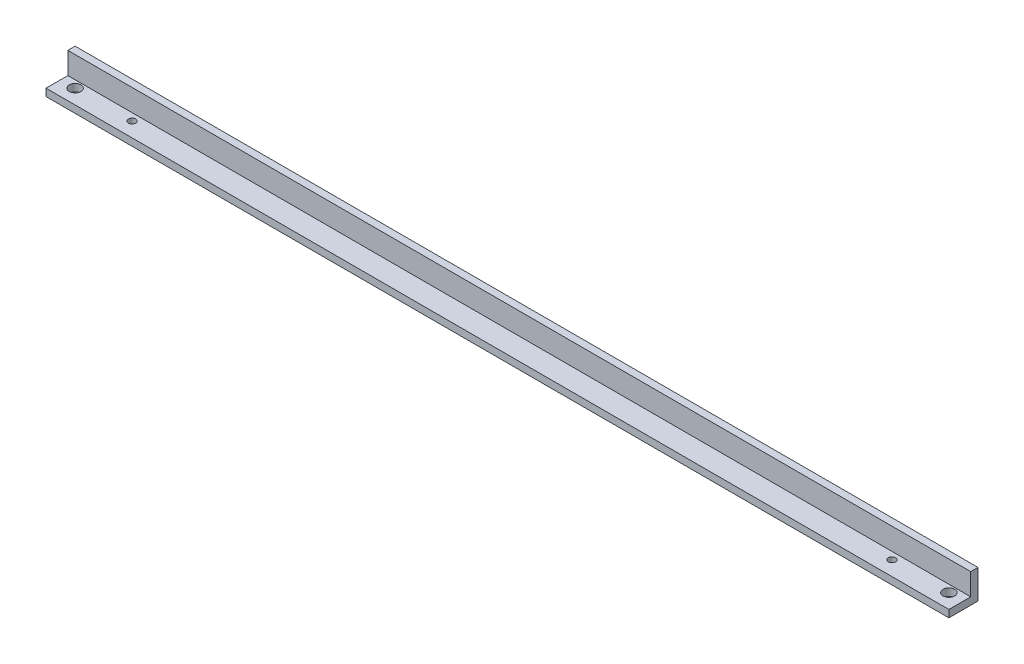
ISO-10303-21;
HEADER;
FILE_DESCRIPTION(('STEP AP214'),'2;1');
FILE_NAME('part.step','',(''),(''),'','','');
FILE_SCHEMA(('AUTOMOTIVE_DESIGN { 1 0 10303 214 1 1 1 1 }'));
ENDSEC;
DATA;
#1=APPLICATION_CONTEXT('core data for automotive mechanical design processes');
#2=APPLICATION_PROTOCOL_DEFINITION('international standard','automotive_design',2000,#1);
#3=PRODUCT_CONTEXT('',#1,'mechanical');
#4=PRODUCT('Part','Part','',(#3));
#5=PRODUCT_RELATED_PRODUCT_CATEGORY('part','',(#4));
#6=PRODUCT_DEFINITION_FORMATION('','',#4);
#7=PRODUCT_DEFINITION_CONTEXT('part definition',#1,'design');
#8=PRODUCT_DEFINITION('design','',#6,#7);
#9=PRODUCT_DEFINITION_SHAPE('','',#8);
#10=(LENGTH_UNIT() NAMED_UNIT(*) SI_UNIT(.MILLI.,.METRE.));
#11=(NAMED_UNIT(*) PLANE_ANGLE_UNIT() SI_UNIT($,.RADIAN.));
#12=(NAMED_UNIT(*) SI_UNIT($,.STERADIAN.) SOLID_ANGLE_UNIT());
#13=UNCERTAINTY_MEASURE_WITH_UNIT(LENGTH_MEASURE(1.E-05),#10,'distance_accuracy_value','');
#14=(GEOMETRIC_REPRESENTATION_CONTEXT(3) GLOBAL_UNCERTAINTY_ASSIGNED_CONTEXT((#13)) GLOBAL_UNIT_ASSIGNED_CONTEXT((#10,
#11,#12)) REPRESENTATION_CONTEXT('',''));
#15=CARTESIAN_POINT('',(0.,0.,0.));
#16=DIRECTION('',(0.,0.,1.));
#17=DIRECTION('',(1.,0.,0.));
#18=AXIS2_PLACEMENT_3D('',#15,#16,#17);
#19=CARTESIAN_POINT('',(787.4,19.05,0.));
#20=DIRECTION('',(0.,-1.,0.));
#21=DIRECTION('',(0.,0.,-1.));
#22=AXIS2_PLACEMENT_3D('',#19,#20,#21);
#23=PLANE('',#22);
#24=DIRECTION('',(0.,0.,1.));
#25=VECTOR('',#24,1.);
#26=CARTESIAN_POINT('',(0.,19.05,0.));
#27=LINE('',#26,#25);
#28=CARTESIAN_POINT('',(0.,19.05,-6.35));
#29=VERTEX_POINT('',#28);
#30=CARTESIAN_POINT('',(0.,19.05,0.));
#31=VERTEX_POINT('',#30);
#32=EDGE_CURVE('E127',#29,#31,#27,.T.);
#33=ORIENTED_EDGE('',*,*,#32,.T.);
#34=DIRECTION('',(-1.,0.,0.));
#35=VECTOR('',#34,1.);
#36=CARTESIAN_POINT('',(787.4,19.05,0.));
#37=LINE('',#36,#35);
#38=CARTESIAN_POINT('',(787.4,19.05,0.));
#39=VERTEX_POINT('',#38);
#40=EDGE_CURVE('E11',#39,#31,#37,.T.);
#41=ORIENTED_EDGE('',*,*,#40,.F.);
#42=DIRECTION('',(0.,0.,1.));
#43=VECTOR('',#42,1.);
#44=CARTESIAN_POINT('',(787.4,19.05,0.));
#45=LINE('',#44,#43);
#46=CARTESIAN_POINT('',(787.4,19.05,-6.35));
#47=VERTEX_POINT('',#46);
#48=EDGE_CURVE('E140',#47,#39,#45,.T.);
#49=ORIENTED_EDGE('',*,*,#48,.F.);
#50=DIRECTION('',(-1.,0.,0.));
#51=VECTOR('',#50,1.);
#52=CARTESIAN_POINT('',(787.4,19.05,-6.35));
#53=LINE('',#52,#51);
#54=EDGE_CURVE('E125',#47,#29,#53,.T.);
#55=ORIENTED_EDGE('',*,*,#54,.T.);
#56=EDGE_LOOP('',(#33,#41,#49,#55));
#57=FACE_BOUND('',#56,.T.);
#58=ADVANCED_FACE('F45',(#57),#23,.F.);
#59=CARTESIAN_POINT('',(787.4,0.,0.));
#60=DIRECTION('',(0.,0.,-1.));
#61=DIRECTION('',(-1.,0.,0.));
#62=AXIS2_PLACEMENT_3D('',#59,#60,#61);
#63=PLANE('',#62);
#64=DIRECTION('',(0.,-1.,0.));
#65=VECTOR('',#64,1.);
#66=CARTESIAN_POINT('',(0.,0.,0.));
#67=LINE('',#66,#65);
#68=CARTESIAN_POINT('',(0.,0.,0.));
#69=VERTEX_POINT('',#68);
#70=EDGE_CURVE('E126',#31,#69,#67,.T.);
#71=ORIENTED_EDGE('',*,*,#70,.T.);
#72=DIRECTION('',(-1.,0.,0.));
#73=VECTOR('',#72,1.);
#74=CARTESIAN_POINT('',(787.4,0.,0.));
#75=LINE('',#74,#73);
#76=CARTESIAN_POINT('',(787.4,0.,0.));
#77=VERTEX_POINT('',#76);
#78=EDGE_CURVE('E49',#77,#69,#75,.T.);
#79=ORIENTED_EDGE('',*,*,#78,.F.);
#80=DIRECTION('',(0.,-1.,0.));
#81=VECTOR('',#80,1.);
#82=CARTESIAN_POINT('',(787.4,0.,0.));
#83=LINE('',#82,#81);
#84=EDGE_CURVE('E91',#39,#77,#83,.T.);
#85=ORIENTED_EDGE('',*,*,#84,.F.);
#86=ORIENTED_EDGE('',*,*,#40,.T.);
#87=EDGE_LOOP('',(#71,#79,#85,#86));
#88=FACE_BOUND('',#87,.T.);
#89=ADVANCED_FACE('F161',(#88),#63,.F.);
#90=CARTESIAN_POINT('',(787.4,0.,19.05));
#91=DIRECTION('',(0.,-1.,0.));
#92=DIRECTION('',(0.,0.,-1.));
#93=AXIS2_PLACEMENT_3D('',#90,#91,#92);
#94=PLANE('',#93);
#95=CARTESIAN_POINT('',(12.7,0.,6.35));
#96=DIRECTION('',(0.,-1.,0.));
#97=DIRECTION('',(0.,0.,-1.));
#98=AXIS2_PLACEMENT_3D('',#95,#96,#97);
#99=CIRCLE('',#98,5.08);
#100=CARTESIAN_POINT('',(12.7,0.,1.27));
#101=VERTEX_POINT('',#100);
#102=EDGE_CURVE('E128',#101,#101,#99,.T.);
#103=ORIENTED_EDGE('',*,*,#102,.T.);
#104=EDGE_LOOP('',(#103));
#105=FACE_BOUND('',#104,.T.);
#106=CARTESIAN_POINT('',(62.357,0.,6.35));
#107=DIRECTION('',(0.,-1.,0.));
#108=DIRECTION('',(0.,0.,-1.));
#109=AXIS2_PLACEMENT_3D('',#106,#107,#108);
#110=CIRCLE('',#109,3.17500000000001);
#111=CARTESIAN_POINT('',(62.357,0.,3.17499999999999));
#112=VERTEX_POINT('',#111);
#113=EDGE_CURVE('E255',#112,#112,#110,.T.);
#114=ORIENTED_EDGE('',*,*,#113,.T.);
#115=EDGE_LOOP('',(#114));
#116=FACE_BOUND('',#115,.T.);
#117=CARTESIAN_POINT('',(725.043,0.,6.35000000000008));
#118=DIRECTION('',(0.,-1.,0.));
#119=DIRECTION('',(0.,0.,-1.));
#120=AXIS2_PLACEMENT_3D('',#117,#118,#119);
#121=CIRCLE('',#120,3.17500000000008);
#122=CARTESIAN_POINT('',(725.043,0.,3.175));
#123=VERTEX_POINT('',#122);
#124=EDGE_CURVE('E253',#123,#123,#121,.T.);
#125=ORIENTED_EDGE('',*,*,#124,.T.);
#126=EDGE_LOOP('',(#125));
#127=FACE_BOUND('',#126,.T.);
#128=CARTESIAN_POINT('',(774.7,0.,6.35000000000009));
#129=DIRECTION('',(0.,-1.,0.));
#130=DIRECTION('',(0.,0.,-1.));
#131=AXIS2_PLACEMENT_3D('',#128,#129,#130);
#132=CIRCLE('',#131,5.08000000000002);
#133=CARTESIAN_POINT('',(774.7,0.,1.27000000000008));
#134=VERTEX_POINT('',#133);
#135=EDGE_CURVE('E262',#134,#134,#132,.T.);
#136=ORIENTED_EDGE('',*,*,#135,.T.);
#137=EDGE_LOOP('',(#136));
#138=FACE_BOUND('',#137,.T.);
#139=DIRECTION('',(0.,0.,1.));
#140=VECTOR('',#139,1.);
#141=CARTESIAN_POINT('',(0.,0.,19.05));
#142=LINE('',#141,#140);
#143=CARTESIAN_POINT('',(0.,0.,19.05));
#144=VERTEX_POINT('',#143);
#145=EDGE_CURVE('E132',#69,#144,#142,.T.);
#146=ORIENTED_EDGE('',*,*,#145,.T.);
#147=DIRECTION('',(-1.,0.,0.));
#148=VECTOR('',#147,1.);
#149=CARTESIAN_POINT('',(787.4,0.,19.05));
#150=LINE('',#149,#148);
#151=CARTESIAN_POINT('',(787.4,0.,19.05));
#152=VERTEX_POINT('',#151);
#153=EDGE_CURVE('E120',#152,#144,#150,.T.);
#154=ORIENTED_EDGE('',*,*,#153,.F.);
#155=DIRECTION('',(0.,0.,1.));
#156=VECTOR('',#155,1.);
#157=CARTESIAN_POINT('',(787.4,0.,19.05));
#158=LINE('',#157,#156);
#159=EDGE_CURVE('E108',#77,#152,#158,.T.);
#160=ORIENTED_EDGE('',*,*,#159,.F.);
#161=ORIENTED_EDGE('',*,*,#78,.T.);
#162=EDGE_LOOP('',(#146,#154,#160,#161));
#163=FACE_BOUND('',#162,.T.);
#164=ADVANCED_FACE('F141',(#105,#116,#127,#138,#163),#94,.F.);
#165=CARTESIAN_POINT('',(787.4,-6.35,19.05));
#166=DIRECTION('',(0.,0.,-1.));
#167=DIRECTION('',(-1.,0.,0.));
#168=AXIS2_PLACEMENT_3D('',#165,#166,#167);
#169=PLANE('',#168);
#170=DIRECTION('',(0.,-1.,0.));
#171=VECTOR('',#170,1.);
#172=CARTESIAN_POINT('',(0.,-6.35,19.05));
#173=LINE('',#172,#171);
#174=CARTESIAN_POINT('',(0.,-6.35,19.05));
#175=VERTEX_POINT('',#174);
#176=EDGE_CURVE('E116',#144,#175,#173,.T.);
#177=ORIENTED_EDGE('',*,*,#176,.T.);
#178=DIRECTION('',(-1.,0.,0.));
#179=VECTOR('',#178,1.);
#180=CARTESIAN_POINT('',(787.4,-6.35,19.05));
#181=LINE('',#180,#179);
#182=CARTESIAN_POINT('',(787.4,-6.35,19.05));
#183=VERTEX_POINT('',#182);
#184=EDGE_CURVE('E113',#183,#175,#181,.T.);
#185=ORIENTED_EDGE('',*,*,#184,.F.);
#186=DIRECTION('',(0.,-1.,0.));
#187=VECTOR('',#186,1.);
#188=CARTESIAN_POINT('',(787.4,-6.35,19.05));
#189=LINE('',#188,#187);
#190=EDGE_CURVE('E105',#152,#183,#189,.T.);
#191=ORIENTED_EDGE('',*,*,#190,.F.);
#192=ORIENTED_EDGE('',*,*,#153,.T.);
#193=EDGE_LOOP('',(#177,#185,#191,#192));
#194=FACE_BOUND('',#193,.T.);
#195=ADVANCED_FACE('F112',(#194),#169,.F.);
#196=CARTESIAN_POINT('',(787.4,-6.35,-6.35));
#197=DIRECTION('',(0.,1.,0.));
#198=DIRECTION('',(0.,0.,1.));
#199=AXIS2_PLACEMENT_3D('',#196,#197,#198);
#200=PLANE('',#199);
#201=CARTESIAN_POINT('',(12.7,-6.35,6.35));
#202=DIRECTION('',(0.,-1.,0.));
#203=DIRECTION('',(0.,0.,-1.));
#204=AXIS2_PLACEMENT_3D('',#201,#202,#203);
#205=CIRCLE('',#204,5.08);
#206=CARTESIAN_POINT('',(12.7,-6.35000000000008,1.27));
#207=VERTEX_POINT('',#206);
#208=EDGE_CURVE('E248',#207,#207,#205,.T.);
#209=ORIENTED_EDGE('',*,*,#208,.F.);
#210=EDGE_LOOP('',(#209));
#211=FACE_BOUND('',#210,.T.);
#212=CARTESIAN_POINT('',(62.357,-6.35,6.35));
#213=DIRECTION('',(0.,-1.,0.));
#214=DIRECTION('',(0.,0.,-1.));
#215=AXIS2_PLACEMENT_3D('',#212,#213,#214);
#216=CIRCLE('',#215,3.17500000000001);
#217=CARTESIAN_POINT('',(62.357,-6.35000000000008,3.17499999999999));
#218=VERTEX_POINT('',#217);
#219=EDGE_CURVE('E272',#218,#218,#216,.T.);
#220=ORIENTED_EDGE('',*,*,#219,.F.);
#221=EDGE_LOOP('',(#220));
#222=FACE_BOUND('',#221,.T.);
#223=CARTESIAN_POINT('',(725.043,-6.35,6.35000000000008));
#224=DIRECTION('',(0.,-1.,0.));
#225=DIRECTION('',(0.,0.,1.));
#226=AXIS2_PLACEMENT_3D('',#223,#224,#225);
#227=CIRCLE('',#226,3.17500000000008);
#228=CARTESIAN_POINT('',(725.043,-6.35000000000008,3.175));
#229=VERTEX_POINT('',#228);
#230=EDGE_CURVE('E268',#229,#229,#227,.T.);
#231=ORIENTED_EDGE('',*,*,#230,.F.);
#232=EDGE_LOOP('',(#231));
#233=FACE_BOUND('',#232,.T.);
#234=CARTESIAN_POINT('',(774.7,-6.35,6.35000000000009));
#235=DIRECTION('',(0.,-1.,0.));
#236=DIRECTION('',(0.,0.,1.));
#237=AXIS2_PLACEMENT_3D('',#234,#235,#236);
#238=CIRCLE('',#237,5.08000000000002);
#239=CARTESIAN_POINT('',(774.7,-6.35000000000008,1.27000000000007));
#240=VERTEX_POINT('',#239);
#241=EDGE_CURVE('E265',#240,#240,#238,.T.);
#242=ORIENTED_EDGE('',*,*,#241,.F.);
#243=EDGE_LOOP('',(#242));
#244=FACE_BOUND('',#243,.T.);
#245=DIRECTION('',(0.,0.,-1.));
#246=VECTOR('',#245,1.);
#247=CARTESIAN_POINT('',(0.,-6.35,-6.35));
#248=LINE('',#247,#246);
#249=CARTESIAN_POINT('',(0.,-6.35,-6.35));
#250=VERTEX_POINT('',#249);
#251=EDGE_CURVE('E82',#175,#250,#248,.T.);
#252=ORIENTED_EDGE('',*,*,#251,.T.);
#253=DIRECTION('',(-1.,0.,0.));
#254=VECTOR('',#253,1.);
#255=CARTESIAN_POINT('',(787.4,-6.35,-6.35));
#256=LINE('',#255,#254);
#257=CARTESIAN_POINT('',(787.4,-6.35,-6.35));
#258=VERTEX_POINT('',#257);
#259=EDGE_CURVE('E117',#258,#250,#256,.T.);
#260=ORIENTED_EDGE('',*,*,#259,.F.);
#261=DIRECTION('',(0.,0.,-1.));
#262=VECTOR('',#261,1.);
#263=CARTESIAN_POINT('',(787.4,-6.35,-6.35));
#264=LINE('',#263,#262);
#265=EDGE_CURVE('E106',#183,#258,#264,.T.);
#266=ORIENTED_EDGE('',*,*,#265,.F.);
#267=ORIENTED_EDGE('',*,*,#184,.T.);
#268=EDGE_LOOP('',(#252,#260,#266,#267));
#269=FACE_BOUND('',#268,.T.);
#270=ADVANCED_FACE('F119',(#211,#222,#233,#244,#269),#200,.F.);
#271=CARTESIAN_POINT('',(787.4,19.05,-6.35));
#272=DIRECTION('',(0.,0.,1.));
#273=DIRECTION('',(0.,-1.,0.));
#274=AXIS2_PLACEMENT_3D('',#271,#272,#273);
#275=PLANE('',#274);
#276=DIRECTION('',(0.,1.,0.));
#277=VECTOR('',#276,1.);
#278=CARTESIAN_POINT('',(0.,19.05,-6.35));
#279=LINE('',#278,#277);
#280=EDGE_CURVE('E89',#250,#29,#279,.T.);
#281=ORIENTED_EDGE('',*,*,#280,.T.);
#282=ORIENTED_EDGE('',*,*,#54,.F.);
#283=DIRECTION('',(0.,1.,0.));
#284=VECTOR('',#283,1.);
#285=CARTESIAN_POINT('',(787.4,19.05,-6.35));
#286=LINE('',#285,#284);
#287=EDGE_CURVE('E59',#258,#47,#286,.T.);
#288=ORIENTED_EDGE('',*,*,#287,.F.);
#289=ORIENTED_EDGE('',*,*,#259,.T.);
#290=EDGE_LOOP('',(#281,#282,#288,#289));
#291=FACE_BOUND('',#290,.T.);
#292=ADVANCED_FACE('F148',(#291),#275,.F.);
#293=CARTESIAN_POINT('',(787.4,0.,0.));
#294=DIRECTION('',(-1.,0.,0.));
#295=DIRECTION('',(0.,0.,1.));
#296=AXIS2_PLACEMENT_3D('',#293,#294,#295);
#297=PLANE('',#296);
#298=ORIENTED_EDGE('',*,*,#48,.T.);
#299=ORIENTED_EDGE('',*,*,#84,.T.);
#300=ORIENTED_EDGE('',*,*,#159,.T.);
#301=ORIENTED_EDGE('',*,*,#190,.T.);
#302=ORIENTED_EDGE('',*,*,#265,.T.);
#303=ORIENTED_EDGE('',*,*,#287,.T.);
#304=EDGE_LOOP('',(#298,#299,#300,#301,#302,#303));
#305=FACE_BOUND('',#304,.T.);
#306=ADVANCED_FACE('F104',(#305),#297,.F.);
#307=CARTESIAN_POINT('',(0.,0.,0.));
#308=DIRECTION('',(-1.,0.,0.));
#309=DIRECTION('',(0.,0.,1.));
#310=AXIS2_PLACEMENT_3D('',#307,#308,#309);
#311=PLANE('',#310);
#312=ORIENTED_EDGE('',*,*,#32,.F.);
#313=ORIENTED_EDGE('',*,*,#280,.F.);
#314=ORIENTED_EDGE('',*,*,#251,.F.);
#315=ORIENTED_EDGE('',*,*,#176,.F.);
#316=ORIENTED_EDGE('',*,*,#145,.F.);
#317=ORIENTED_EDGE('',*,*,#70,.F.);
#318=EDGE_LOOP('',(#312,#313,#314,#315,#316,#317));
#319=FACE_BOUND('',#318,.T.);
#320=ADVANCED_FACE('F147',(#319),#311,.T.);
#321=CARTESIAN_POINT('',(774.7,908.05,6.35000000000022));
#322=DIRECTION('',(0.,-1.,0.));
#323=DIRECTION('',(0.,0.,-1.));
#324=AXIS2_PLACEMENT_3D('',#321,#322,#323);
#325=CYLINDRICAL_SURFACE('',#324,5.08000000000002);
#326=CARTESIAN_POINT('',(774.7,-6.35000000000008,1.27000000000007));
#327=CARTESIAN_POINT('',(774.7,-6.28385416666673,1.27000000000007));
#328=CARTESIAN_POINT('',(774.7,-6.21770833333339,1.27000000000007));
#329=CARTESIAN_POINT('',(774.7,-6.08541666666673,1.27000000000007));
#330=CARTESIAN_POINT('',(774.7,-6.01927083333342,1.27000000000007));
#331=CARTESIAN_POINT('',(774.7,-5.88697916666677,1.27000000000007));
#332=CARTESIAN_POINT('',(774.7,-5.82083333333342,1.27000000000007));
#333=CARTESIAN_POINT('',(774.7,-5.68854166666673,1.27000000000007));
#334=CARTESIAN_POINT('',(774.7,-5.62239583333339,1.27000000000007));
#335=CARTESIAN_POINT('',(774.7,-5.49010416666673,1.27000000000007));
#336=CARTESIAN_POINT('',(774.7,-5.42395833333342,1.27000000000008));
#337=CARTESIAN_POINT('',(774.7,-5.29166666666677,1.27000000000008));
#338=CARTESIAN_POINT('',(774.7,-5.22552083333342,1.27000000000008));
#339=CARTESIAN_POINT('',(774.7,-5.09322916666673,1.27000000000008));
#340=CARTESIAN_POINT('',(774.7,-5.02708333333339,1.27000000000008));
#341=CARTESIAN_POINT('',(774.7,-4.89479166666669,1.27000000000008));
#342=CARTESIAN_POINT('',(774.7,-4.82864583333335,1.27000000000008));
#343=CARTESIAN_POINT('',(774.7,-4.69635416666669,1.27000000000008));
#344=CARTESIAN_POINT('',(774.7,-4.63020833333339,1.27000000000008));
#345=CARTESIAN_POINT('',(774.7,-4.49791666666673,1.27000000000008));
#346=CARTESIAN_POINT('',(774.7,-4.43177083333339,1.27000000000008));
#347=CARTESIAN_POINT('',(774.7,-4.29947916666669,1.27000000000008));
#348=CARTESIAN_POINT('',(774.7,-4.23333333333335,1.27000000000008));
#349=CARTESIAN_POINT('',(774.7,-4.10104166666669,1.27000000000008));
#350=CARTESIAN_POINT('',(774.7,-4.03489583333339,1.27000000000008));
#351=CARTESIAN_POINT('',(774.7,-3.90260416666673,1.27000000000008));
#352=CARTESIAN_POINT('',(774.7,-3.83645833333338,1.27000000000008));
#353=CARTESIAN_POINT('',(774.7,-3.70416666666669,1.27000000000008));
#354=CARTESIAN_POINT('',(774.7,-3.63802083333335,1.27000000000008));
#355=CARTESIAN_POINT('',(774.7,-3.50572916666669,1.27000000000008));
#356=CARTESIAN_POINT('',(774.7,-3.43958333333338,1.27000000000008));
#357=CARTESIAN_POINT('',(774.7,-3.30729166666673,1.27000000000008));
#358=CARTESIAN_POINT('',(774.7,-3.24114583333338,1.27000000000008));
#359=CARTESIAN_POINT('',(774.7,-3.10885416666669,1.27000000000008));
#360=CARTESIAN_POINT('',(774.7,-3.04270833333335,1.27000000000008));
#361=CARTESIAN_POINT('',(774.7,-2.91041666666669,1.27000000000008));
#362=CARTESIAN_POINT('',(774.7,-2.84427083333338,1.27000000000008));
#363=CARTESIAN_POINT('',(774.7,-2.71197916666673,1.27000000000008));
#364=CARTESIAN_POINT('',(774.7,-2.64583333333338,1.27000000000008));
#365=CARTESIAN_POINT('',(774.7,-2.51354166666669,1.27000000000008));
#366=CARTESIAN_POINT('',(774.7,-2.44739583333335,1.27000000000008));
#367=CARTESIAN_POINT('',(774.7,-2.31510416666669,1.27000000000008));
#368=CARTESIAN_POINT('',(774.7,-2.24895833333338,1.27000000000008));
#369=CARTESIAN_POINT('',(774.7,-2.11666666666673,1.27000000000008));
#370=CARTESIAN_POINT('',(774.7,-2.05052083333338,1.27000000000008));
#371=CARTESIAN_POINT('',(774.7,-1.91822916666669,1.27000000000008));
#372=CARTESIAN_POINT('',(774.7,-1.85208333333335,1.27000000000008));
#373=CARTESIAN_POINT('',(774.7,-1.71979166666669,1.27000000000008));
#374=CARTESIAN_POINT('',(774.7,-1.65364583333338,1.27000000000008));
#375=CARTESIAN_POINT('',(774.7,-1.52135416666673,1.27000000000008));
#376=CARTESIAN_POINT('',(774.7,-1.45520833333338,1.27000000000008));
#377=CARTESIAN_POINT('',(774.7,-1.32291666666669,1.27000000000008));
#378=CARTESIAN_POINT('',(774.7,-1.25677083333335,1.27000000000008));
#379=CARTESIAN_POINT('',(774.7,-1.12447916666665,1.27000000000008));
#380=CARTESIAN_POINT('',(774.7,-1.05833333333331,1.27000000000008));
#381=CARTESIAN_POINT('',(774.7,-0.926041666666655,1.27000000000008));
#382=CARTESIAN_POINT('',(774.7,-0.859895833333346,1.27000000000008));
#383=CARTESIAN_POINT('',(774.7,-0.727604166666692,1.27000000000008));
#384=CARTESIAN_POINT('',(774.7,-0.661458333333346,1.27000000000008));
#385=CARTESIAN_POINT('',(774.7,-0.529166666666655,1.27000000000008));
#386=CARTESIAN_POINT('',(774.7,-0.463020833333309,1.27000000000008));
#387=CARTESIAN_POINT('',(774.7,-0.330729166666655,1.27000000000008));
#388=CARTESIAN_POINT('',(774.7,-0.264583333333346,1.27000000000008));
#389=CARTESIAN_POINT('',(774.7,-0.132291666666691,1.27000000000008));
#390=CARTESIAN_POINT('',(774.7,-0.0661458333333458,1.27000000000008));
#391=CARTESIAN_POINT('',(774.7,0.,1.27000000000008));
#392=B_SPLINE_CURVE_WITH_KNOTS('',3,(#326,#327,#328,#329,#330,#331,#332,#333,#334,#335,#336,
#337,#338,#339,#340,#341,#342,#343,#344,#345,#346,#347,#348,#349,#350,#351,#352,#353,#354,#355,
#356,#357,#358,#359,#360,#361,#362,#363,#364,#365,#366,#367,#368,#369,#370,#371,#372,#373,#374,
#375,#376,#377,#378,#379,#380,#381,#382,#383,#384,#385,#386,#387,#388,#389,#390,#391),
.UNSPECIFIED.,.F.,.F.,(4,2,2,2,2,2,2,2,2,2,2,2,2,2,2,2,2,2,2,2,2,2,2,2,2,2,2,2,2,2,2,2,4),(0.,
0.198437500000037,0.396874999999963,0.5953125,0.793750000000037,0.992187499999964,1.190625,
1.38906250000004,1.58750000000007,1.7859375,1.98437500000004,2.18281250000008,2.38125,
2.57968750000004,2.77812500000008,2.9765625,3.17500000000004,3.37343750000008,3.571875,
3.77031250000004,3.96875000000008,4.1671875,4.36562500000004,4.56406250000008,4.7625,
4.96093750000004,5.15937500000008,5.35781250000011,5.55625000000004,5.75468750000008,
5.95312500000011,6.15156250000004,6.35000000000008),.UNSPECIFIED.);
#393=EDGE_CURVE('BSEAM207',#240,#134,#392,.T.);
#394=ORIENTED_EDGE('',*,*,#241,.T.);
#395=ORIENTED_EDGE('',*,*,#135,.F.);
#396=ORIENTED_EDGE('',*,*,#393,.T.);
#397=ORIENTED_EDGE('',*,*,#393,.F.);
#398=EDGE_LOOP('',(#394,#396,#395,#397));
#399=FACE_BOUND('',#398,.T.);
#400=ADVANCED_FACE('F207',(#399),#325,.F.);
#401=CARTESIAN_POINT('',(725.043,908.05,6.3500000000002));
#402=DIRECTION('',(0.,-1.,0.));
#403=DIRECTION('',(0.,0.,-1.));
#404=AXIS2_PLACEMENT_3D('',#401,#402,#403);
#405=CYLINDRICAL_SURFACE('',#404,3.17500000000008);
#406=CARTESIAN_POINT('',(725.043,-6.35000000000008,3.175));
#407=CARTESIAN_POINT('',(725.043,-6.28385416666673,3.175));
#408=CARTESIAN_POINT('',(725.043,-6.21770833333339,3.175));
#409=CARTESIAN_POINT('',(725.043,-6.08541666666673,3.175));
#410=CARTESIAN_POINT('',(725.043,-6.01927083333342,3.175));
#411=CARTESIAN_POINT('',(725.043,-5.88697916666677,3.175));
#412=CARTESIAN_POINT('',(725.043,-5.82083333333342,3.175));
#413=CARTESIAN_POINT('',(725.043,-5.68854166666673,3.175));
#414=CARTESIAN_POINT('',(725.043,-5.62239583333339,3.175));
#415=CARTESIAN_POINT('',(725.043,-5.49010416666673,3.175));
#416=CARTESIAN_POINT('',(725.043,-5.42395833333342,3.175));
#417=CARTESIAN_POINT('',(725.043,-5.29166666666677,3.175));
#418=CARTESIAN_POINT('',(725.043,-5.22552083333342,3.175));
#419=CARTESIAN_POINT('',(725.043,-5.09322916666673,3.175));
#420=CARTESIAN_POINT('',(725.043,-5.02708333333339,3.175));
#421=CARTESIAN_POINT('',(725.043,-4.89479166666669,3.175));
#422=CARTESIAN_POINT('',(725.043,-4.82864583333335,3.175));
#423=CARTESIAN_POINT('',(725.043,-4.69635416666669,3.175));
#424=CARTESIAN_POINT('',(725.043,-4.63020833333339,3.175));
#425=CARTESIAN_POINT('',(725.043,-4.49791666666673,3.175));
#426=CARTESIAN_POINT('',(725.043,-4.43177083333339,3.175));
#427=CARTESIAN_POINT('',(725.043,-4.29947916666669,3.175));
#428=CARTESIAN_POINT('',(725.043,-4.23333333333335,3.175));
#429=CARTESIAN_POINT('',(725.043,-4.10104166666669,3.175));
#430=CARTESIAN_POINT('',(725.043,-4.03489583333339,3.175));
#431=CARTESIAN_POINT('',(725.043,-3.90260416666673,3.175));
#432=CARTESIAN_POINT('',(725.043,-3.83645833333338,3.175));
#433=CARTESIAN_POINT('',(725.043,-3.70416666666669,3.175));
#434=CARTESIAN_POINT('',(725.043,-3.63802083333335,3.175));
#435=CARTESIAN_POINT('',(725.043,-3.50572916666669,3.175));
#436=CARTESIAN_POINT('',(725.043,-3.43958333333338,3.175));
#437=CARTESIAN_POINT('',(725.043,-3.30729166666673,3.175));
#438=CARTESIAN_POINT('',(725.043,-3.24114583333338,3.175));
#439=CARTESIAN_POINT('',(725.043,-3.10885416666669,3.175));
#440=CARTESIAN_POINT('',(725.043,-3.04270833333335,3.175));
#441=CARTESIAN_POINT('',(725.043,-2.91041666666669,3.175));
#442=CARTESIAN_POINT('',(725.043,-2.84427083333338,3.175));
#443=CARTESIAN_POINT('',(725.043,-2.71197916666673,3.175));
#444=CARTESIAN_POINT('',(725.043,-2.64583333333338,3.175));
#445=CARTESIAN_POINT('',(725.043,-2.51354166666669,3.175));
#446=CARTESIAN_POINT('',(725.043,-2.44739583333335,3.175));
#447=CARTESIAN_POINT('',(725.043,-2.31510416666669,3.175));
#448=CARTESIAN_POINT('',(725.043,-2.24895833333338,3.175));
#449=CARTESIAN_POINT('',(725.043,-2.11666666666673,3.175));
#450=CARTESIAN_POINT('',(725.043,-2.05052083333338,3.175));
#451=CARTESIAN_POINT('',(725.043,-1.91822916666669,3.175));
#452=CARTESIAN_POINT('',(725.043,-1.85208333333335,3.175));
#453=CARTESIAN_POINT('',(725.043,-1.71979166666669,3.175));
#454=CARTESIAN_POINT('',(725.043,-1.65364583333338,3.175));
#455=CARTESIAN_POINT('',(725.043,-1.52135416666673,3.175));
#456=CARTESIAN_POINT('',(725.043,-1.45520833333338,3.175));
#457=CARTESIAN_POINT('',(725.043,-1.32291666666669,3.175));
#458=CARTESIAN_POINT('',(725.043,-1.25677083333335,3.175));
#459=CARTESIAN_POINT('',(725.043,-1.12447916666665,3.175));
#460=CARTESIAN_POINT('',(725.043,-1.05833333333331,3.175));
#461=CARTESIAN_POINT('',(725.043,-0.926041666666655,3.175));
#462=CARTESIAN_POINT('',(725.043,-0.859895833333346,3.175));
#463=CARTESIAN_POINT('',(725.043,-0.727604166666692,3.175));
#464=CARTESIAN_POINT('',(725.043,-0.661458333333346,3.175));
#465=CARTESIAN_POINT('',(725.043,-0.529166666666655,3.175));
#466=CARTESIAN_POINT('',(725.043,-0.463020833333309,3.175));
#467=CARTESIAN_POINT('',(725.043,-0.330729166666655,3.175));
#468=CARTESIAN_POINT('',(725.043,-0.264583333333346,3.175));
#469=CARTESIAN_POINT('',(725.043,-0.132291666666691,3.175));
#470=CARTESIAN_POINT('',(725.043,-0.0661458333333458,3.175));
#471=CARTESIAN_POINT('',(725.043,0.,3.175));
#472=B_SPLINE_CURVE_WITH_KNOTS('',3,(#406,#407,#408,#409,#410,#411,#412,#413,#414,#415,#416,
#417,#418,#419,#420,#421,#422,#423,#424,#425,#426,#427,#428,#429,#430,#431,#432,#433,#434,#435,
#436,#437,#438,#439,#440,#441,#442,#443,#444,#445,#446,#447,#448,#449,#450,#451,#452,#453,#454,
#455,#456,#457,#458,#459,#460,#461,#462,#463,#464,#465,#466,#467,#468,#469,#470,#471),
.UNSPECIFIED.,.F.,.F.,(4,2,2,2,2,2,2,2,2,2,2,2,2,2,2,2,2,2,2,2,2,2,2,2,2,2,2,2,2,2,2,2,4),(0.,
0.198437500000037,0.396874999999963,0.5953125,0.793750000000037,0.992187499999964,1.190625,
1.38906250000004,1.58750000000007,1.7859375,1.98437500000004,2.18281250000008,2.38125,
2.57968750000004,2.77812500000008,2.9765625,3.17500000000004,3.37343750000008,3.571875,
3.77031250000004,3.96875000000008,4.1671875,4.36562500000004,4.56406250000008,4.7625,
4.96093750000004,5.15937500000008,5.35781250000011,5.55625000000004,5.75468750000008,
5.95312500000011,6.15156250000004,6.35000000000008),.UNSPECIFIED.);
#473=EDGE_CURVE('BSEAM214',#229,#123,#472,.T.);
#474=ORIENTED_EDGE('',*,*,#230,.T.);
#475=ORIENTED_EDGE('',*,*,#124,.F.);
#476=ORIENTED_EDGE('',*,*,#473,.T.);
#477=ORIENTED_EDGE('',*,*,#473,.F.);
#478=EDGE_LOOP('',(#474,#476,#475,#477));
#479=FACE_BOUND('',#478,.T.);
#480=ADVANCED_FACE('F214',(#479),#405,.F.);
#481=CARTESIAN_POINT('',(62.357,908.05,6.35000000000012));
#482=DIRECTION('',(0.,-1.,0.));
#483=DIRECTION('',(0.,0.,-1.));
#484=AXIS2_PLACEMENT_3D('',#481,#482,#483);
#485=CYLINDRICAL_SURFACE('',#484,3.17500000000001);
#486=CARTESIAN_POINT('',(62.357,-6.35000000000008,3.17499999999999));
#487=CARTESIAN_POINT('',(62.357,-6.28385416666673,3.17499999999999));
#488=CARTESIAN_POINT('',(62.357,-6.21770833333339,3.17499999999999));
#489=CARTESIAN_POINT('',(62.357,-6.08541666666673,3.17499999999999));
#490=CARTESIAN_POINT('',(62.357,-6.01927083333342,3.17499999999999));
#491=CARTESIAN_POINT('',(62.357,-5.88697916666677,3.17499999999999));
#492=CARTESIAN_POINT('',(62.357,-5.82083333333342,3.17499999999999));
#493=CARTESIAN_POINT('',(62.357,-5.68854166666673,3.17499999999999));
#494=CARTESIAN_POINT('',(62.357,-5.62239583333339,3.17499999999999));
#495=CARTESIAN_POINT('',(62.357,-5.49010416666673,3.17499999999999));
#496=CARTESIAN_POINT('',(62.357,-5.42395833333342,3.17499999999999));
#497=CARTESIAN_POINT('',(62.357,-5.29166666666677,3.17499999999999));
#498=CARTESIAN_POINT('',(62.357,-5.22552083333342,3.17499999999999));
#499=CARTESIAN_POINT('',(62.357,-5.09322916666673,3.17499999999999));
#500=CARTESIAN_POINT('',(62.357,-5.02708333333339,3.17499999999999));
#501=CARTESIAN_POINT('',(62.357,-4.89479166666669,3.17499999999999));
#502=CARTESIAN_POINT('',(62.357,-4.82864583333335,3.17499999999999));
#503=CARTESIAN_POINT('',(62.357,-4.69635416666669,3.17499999999999));
#504=CARTESIAN_POINT('',(62.357,-4.63020833333339,3.17499999999999));
#505=CARTESIAN_POINT('',(62.357,-4.49791666666673,3.17499999999999));
#506=CARTESIAN_POINT('',(62.357,-4.43177083333339,3.17499999999999));
#507=CARTESIAN_POINT('',(62.357,-4.29947916666669,3.17499999999999));
#508=CARTESIAN_POINT('',(62.357,-4.23333333333335,3.17499999999999));
#509=CARTESIAN_POINT('',(62.357,-4.10104166666669,3.17499999999999));
#510=CARTESIAN_POINT('',(62.357,-4.03489583333339,3.17499999999999));
#511=CARTESIAN_POINT('',(62.357,-3.90260416666673,3.17499999999999));
#512=CARTESIAN_POINT('',(62.357,-3.83645833333338,3.17499999999999));
#513=CARTESIAN_POINT('',(62.357,-3.70416666666669,3.17499999999999));
#514=CARTESIAN_POINT('',(62.357,-3.63802083333335,3.17499999999999));
#515=CARTESIAN_POINT('',(62.357,-3.50572916666669,3.17499999999999));
#516=CARTESIAN_POINT('',(62.357,-3.43958333333338,3.17499999999999));
#517=CARTESIAN_POINT('',(62.357,-3.30729166666673,3.17499999999999));
#518=CARTESIAN_POINT('',(62.357,-3.24114583333338,3.17499999999999));
#519=CARTESIAN_POINT('',(62.357,-3.10885416666669,3.17499999999999));
#520=CARTESIAN_POINT('',(62.357,-3.04270833333335,3.17499999999999));
#521=CARTESIAN_POINT('',(62.357,-2.91041666666669,3.17499999999999));
#522=CARTESIAN_POINT('',(62.357,-2.84427083333338,3.17499999999999));
#523=CARTESIAN_POINT('',(62.357,-2.71197916666673,3.17499999999999));
#524=CARTESIAN_POINT('',(62.357,-2.64583333333338,3.17499999999999));
#525=CARTESIAN_POINT('',(62.357,-2.51354166666669,3.17499999999999));
#526=CARTESIAN_POINT('',(62.357,-2.44739583333335,3.17499999999999));
#527=CARTESIAN_POINT('',(62.357,-2.31510416666669,3.17499999999999));
#528=CARTESIAN_POINT('',(62.357,-2.24895833333338,3.17499999999999));
#529=CARTESIAN_POINT('',(62.357,-2.11666666666673,3.17499999999999));
#530=CARTESIAN_POINT('',(62.357,-2.05052083333338,3.17499999999999));
#531=CARTESIAN_POINT('',(62.357,-1.91822916666669,3.17499999999999));
#532=CARTESIAN_POINT('',(62.357,-1.85208333333335,3.17499999999999));
#533=CARTESIAN_POINT('',(62.357,-1.71979166666669,3.17499999999999));
#534=CARTESIAN_POINT('',(62.357,-1.65364583333338,3.17499999999999));
#535=CARTESIAN_POINT('',(62.357,-1.52135416666673,3.17499999999999));
#536=CARTESIAN_POINT('',(62.357,-1.45520833333338,3.17499999999999));
#537=CARTESIAN_POINT('',(62.357,-1.32291666666669,3.17499999999999));
#538=CARTESIAN_POINT('',(62.357,-1.25677083333335,3.17499999999999));
#539=CARTESIAN_POINT('',(62.357,-1.12447916666665,3.17499999999999));
#540=CARTESIAN_POINT('',(62.357,-1.05833333333331,3.17499999999999));
#541=CARTESIAN_POINT('',(62.357,-0.926041666666655,3.17499999999999));
#542=CARTESIAN_POINT('',(62.357,-0.859895833333346,3.17499999999999));
#543=CARTESIAN_POINT('',(62.357,-0.727604166666692,3.17499999999999));
#544=CARTESIAN_POINT('',(62.357,-0.661458333333346,3.17499999999999));
#545=CARTESIAN_POINT('',(62.357,-0.529166666666655,3.17499999999999));
#546=CARTESIAN_POINT('',(62.357,-0.463020833333309,3.17499999999999));
#547=CARTESIAN_POINT('',(62.357,-0.330729166666655,3.17499999999999));
#548=CARTESIAN_POINT('',(62.357,-0.264583333333346,3.17499999999999));
#549=CARTESIAN_POINT('',(62.357,-0.132291666666691,3.17499999999999));
#550=CARTESIAN_POINT('',(62.357,-0.0661458333333458,3.17499999999999));
#551=CARTESIAN_POINT('',(62.357,0.,3.17499999999999));
#552=B_SPLINE_CURVE_WITH_KNOTS('',3,(#486,#487,#488,#489,#490,#491,#492,#493,#494,#495,#496,
#497,#498,#499,#500,#501,#502,#503,#504,#505,#506,#507,#508,#509,#510,#511,#512,#513,#514,#515,
#516,#517,#518,#519,#520,#521,#522,#523,#524,#525,#526,#527,#528,#529,#530,#531,#532,#533,#534,
#535,#536,#537,#538,#539,#540,#541,#542,#543,#544,#545,#546,#547,#548,#549,#550,#551),
.UNSPECIFIED.,.F.,.F.,(4,2,2,2,2,2,2,2,2,2,2,2,2,2,2,2,2,2,2,2,2,2,2,2,2,2,2,2,2,2,2,2,4),(0.,
0.198437500000037,0.396874999999963,0.5953125,0.793750000000037,0.992187499999964,1.190625,
1.38906250000004,1.58750000000007,1.7859375,1.98437500000004,2.18281250000008,2.38125,
2.57968750000004,2.77812500000008,2.9765625,3.17500000000004,3.37343750000008,3.571875,
3.77031250000004,3.96875000000008,4.1671875,4.36562500000004,4.56406250000008,4.7625,
4.96093750000004,5.15937500000008,5.35781250000011,5.55625000000004,5.75468750000008,
5.95312500000011,6.15156250000004,6.35000000000008),.UNSPECIFIED.);
#553=EDGE_CURVE('BSEAM223',#218,#112,#552,.T.);
#554=ORIENTED_EDGE('',*,*,#219,.T.);
#555=ORIENTED_EDGE('',*,*,#113,.F.);
#556=ORIENTED_EDGE('',*,*,#553,.T.);
#557=ORIENTED_EDGE('',*,*,#553,.F.);
#558=EDGE_LOOP('',(#554,#556,#555,#557));
#559=FACE_BOUND('',#558,.T.);
#560=ADVANCED_FACE('F223',(#559),#485,.F.);
#561=CARTESIAN_POINT('',(12.7,908.05,6.35000000000012));
#562=DIRECTION('',(0.,-1.,0.));
#563=DIRECTION('',(0.,0.,-1.));
#564=AXIS2_PLACEMENT_3D('',#561,#562,#563);
#565=CYLINDRICAL_SURFACE('',#564,5.08);
#566=CARTESIAN_POINT('',(12.7,-6.35000000000008,1.27));
#567=CARTESIAN_POINT('',(12.7,-6.28385416666673,1.27));
#568=CARTESIAN_POINT('',(12.7,-6.21770833333339,1.27));
#569=CARTESIAN_POINT('',(12.7,-6.08541666666673,1.27));
#570=CARTESIAN_POINT('',(12.7,-6.01927083333342,1.27));
#571=CARTESIAN_POINT('',(12.7,-5.88697916666677,1.27));
#572=CARTESIAN_POINT('',(12.7,-5.82083333333342,1.27));
#573=CARTESIAN_POINT('',(12.7,-5.68854166666673,1.27));
#574=CARTESIAN_POINT('',(12.7,-5.62239583333339,1.27));
#575=CARTESIAN_POINT('',(12.7,-5.49010416666673,1.27));
#576=CARTESIAN_POINT('',(12.7,-5.42395833333342,1.27));
#577=CARTESIAN_POINT('',(12.7,-5.29166666666677,1.27));
#578=CARTESIAN_POINT('',(12.7,-5.22552083333342,1.27));
#579=CARTESIAN_POINT('',(12.7,-5.09322916666673,1.27));
#580=CARTESIAN_POINT('',(12.7,-5.02708333333339,1.27));
#581=CARTESIAN_POINT('',(12.7,-4.89479166666669,1.27));
#582=CARTESIAN_POINT('',(12.7,-4.82864583333335,1.27));
#583=CARTESIAN_POINT('',(12.7,-4.69635416666669,1.27));
#584=CARTESIAN_POINT('',(12.7,-4.63020833333339,1.27));
#585=CARTESIAN_POINT('',(12.7,-4.49791666666673,1.27));
#586=CARTESIAN_POINT('',(12.7,-4.43177083333339,1.27));
#587=CARTESIAN_POINT('',(12.7,-4.29947916666669,1.27));
#588=CARTESIAN_POINT('',(12.7,-4.23333333333335,1.27));
#589=CARTESIAN_POINT('',(12.7,-4.10104166666669,1.27));
#590=CARTESIAN_POINT('',(12.7,-4.03489583333339,1.27));
#591=CARTESIAN_POINT('',(12.7,-3.90260416666673,1.27));
#592=CARTESIAN_POINT('',(12.7,-3.83645833333338,1.27));
#593=CARTESIAN_POINT('',(12.7,-3.70416666666669,1.27));
#594=CARTESIAN_POINT('',(12.7,-3.63802083333335,1.27));
#595=CARTESIAN_POINT('',(12.7,-3.50572916666669,1.27));
#596=CARTESIAN_POINT('',(12.7,-3.43958333333338,1.27));
#597=CARTESIAN_POINT('',(12.7,-3.30729166666673,1.27));
#598=CARTESIAN_POINT('',(12.7,-3.24114583333338,1.27));
#599=CARTESIAN_POINT('',(12.7,-3.10885416666669,1.27));
#600=CARTESIAN_POINT('',(12.7,-3.04270833333335,1.27));
#601=CARTESIAN_POINT('',(12.7,-2.91041666666669,1.27));
#602=CARTESIAN_POINT('',(12.7,-2.84427083333338,1.27));
#603=CARTESIAN_POINT('',(12.7,-2.71197916666673,1.27));
#604=CARTESIAN_POINT('',(12.7,-2.64583333333338,1.27));
#605=CARTESIAN_POINT('',(12.7,-2.51354166666669,1.27));
#606=CARTESIAN_POINT('',(12.7,-2.44739583333335,1.27));
#607=CARTESIAN_POINT('',(12.7,-2.31510416666669,1.27));
#608=CARTESIAN_POINT('',(12.7,-2.24895833333338,1.27));
#609=CARTESIAN_POINT('',(12.7,-2.11666666666673,1.27));
#610=CARTESIAN_POINT('',(12.7,-2.05052083333338,1.27));
#611=CARTESIAN_POINT('',(12.7,-1.91822916666669,1.27));
#612=CARTESIAN_POINT('',(12.7,-1.85208333333335,1.27));
#613=CARTESIAN_POINT('',(12.7,-1.71979166666669,1.27));
#614=CARTESIAN_POINT('',(12.7,-1.65364583333338,1.27));
#615=CARTESIAN_POINT('',(12.7,-1.52135416666673,1.27));
#616=CARTESIAN_POINT('',(12.7,-1.45520833333338,1.27));
#617=CARTESIAN_POINT('',(12.7,-1.32291666666669,1.27));
#618=CARTESIAN_POINT('',(12.7,-1.25677083333335,1.27));
#619=CARTESIAN_POINT('',(12.7,-1.12447916666665,1.27));
#620=CARTESIAN_POINT('',(12.7,-1.05833333333331,1.27));
#621=CARTESIAN_POINT('',(12.7,-0.926041666666655,1.27));
#622=CARTESIAN_POINT('',(12.7,-0.859895833333346,1.27));
#623=CARTESIAN_POINT('',(12.7,-0.727604166666692,1.27));
#624=CARTESIAN_POINT('',(12.7,-0.661458333333346,1.27));
#625=CARTESIAN_POINT('',(12.7,-0.529166666666655,1.27));
#626=CARTESIAN_POINT('',(12.7,-0.463020833333309,1.27));
#627=CARTESIAN_POINT('',(12.7,-0.330729166666655,1.27));
#628=CARTESIAN_POINT('',(12.7,-0.264583333333346,1.27));
#629=CARTESIAN_POINT('',(12.7,-0.132291666666691,1.27));
#630=CARTESIAN_POINT('',(12.7,-0.0661458333333458,1.27));
#631=CARTESIAN_POINT('',(12.7,0.,1.27));
#632=B_SPLINE_CURVE_WITH_KNOTS('',3,(#566,#567,#568,#569,#570,#571,#572,#573,#574,#575,#576,
#577,#578,#579,#580,#581,#582,#583,#584,#585,#586,#587,#588,#589,#590,#591,#592,#593,#594,#595,
#596,#597,#598,#599,#600,#601,#602,#603,#604,#605,#606,#607,#608,#609,#610,#611,#612,#613,#614,
#615,#616,#617,#618,#619,#620,#621,#622,#623,#624,#625,#626,#627,#628,#629,#630,#631),
.UNSPECIFIED.,.F.,.F.,(4,2,2,2,2,2,2,2,2,2,2,2,2,2,2,2,2,2,2,2,2,2,2,2,2,2,2,2,2,2,2,2,4),(0.,
0.198437500000037,0.396874999999963,0.5953125,0.793750000000037,0.992187499999964,1.190625,
1.38906250000004,1.58750000000007,1.7859375,1.98437500000004,2.18281250000008,2.38125,
2.57968750000004,2.77812500000008,2.9765625,3.17500000000004,3.37343750000008,3.571875,
3.77031250000004,3.96875000000008,4.1671875,4.36562500000004,4.56406250000008,4.7625,
4.96093750000004,5.15937500000008,5.35781250000011,5.55625000000004,5.75468750000008,
5.95312500000011,6.15156250000004,6.35000000000008),.UNSPECIFIED.);
#633=EDGE_CURVE('BSEAM231',#207,#101,#632,.T.);
#634=ORIENTED_EDGE('',*,*,#208,.T.);
#635=ORIENTED_EDGE('',*,*,#102,.F.);
#636=ORIENTED_EDGE('',*,*,#633,.T.);
#637=ORIENTED_EDGE('',*,*,#633,.F.);
#638=EDGE_LOOP('',(#634,#636,#635,#637));
#639=FACE_BOUND('',#638,.T.);
#640=ADVANCED_FACE('F231',(#639),#565,.F.);
#641=CLOSED_SHELL('',(#58,#89,#164,#195,#270,#292,#306,#320,#400,#480,#560,#640));
#642=MANIFOLD_SOLID_BREP('B2',#641);
#643=ADVANCED_BREP_SHAPE_REPRESENTATION('',(#18,#642),#14);
#644=SHAPE_DEFINITION_REPRESENTATION(#9,#643);
ENDSEC;
END-ISO-10303-21;
